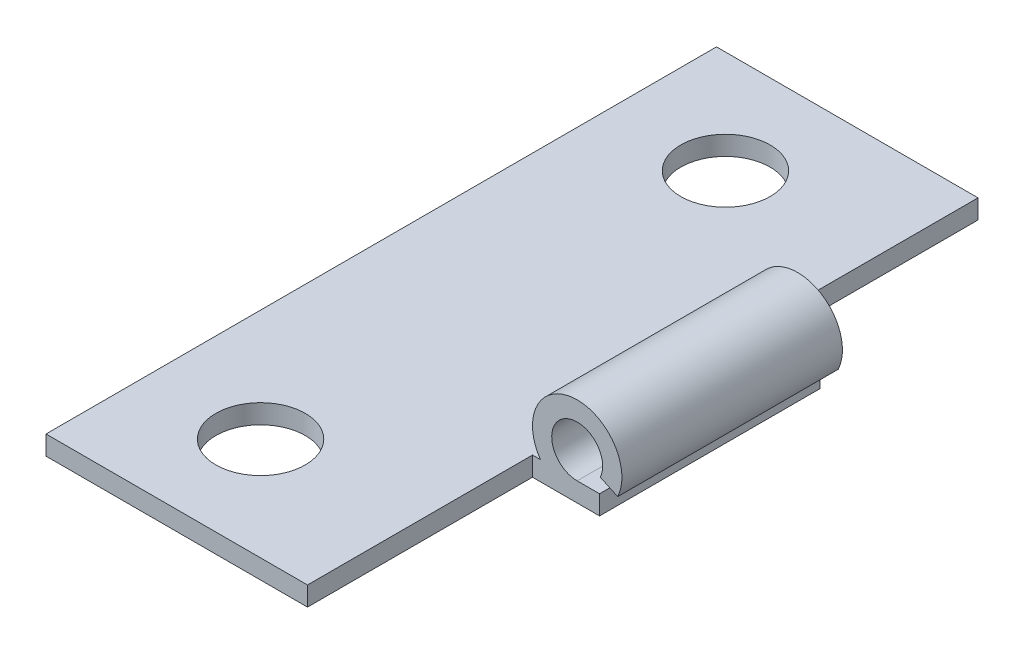
ISO-10303-21;
HEADER;
FILE_DESCRIPTION(('STEP AP214'),'2;1');
FILE_NAME('part.step','',(''),(''),'','','');
FILE_SCHEMA(('AUTOMOTIVE_DESIGN { 1 0 10303 214 1 1 1 1 }'));
ENDSEC;
DATA;
#1=APPLICATION_CONTEXT('core data for automotive mechanical design processes');
#2=APPLICATION_PROTOCOL_DEFINITION('international standard','automotive_design',2000,#1);
#3=PRODUCT_CONTEXT('',#1,'mechanical');
#4=PRODUCT('Part','Part','',(#3));
#5=PRODUCT_RELATED_PRODUCT_CATEGORY('part','',(#4));
#6=PRODUCT_DEFINITION_FORMATION('','',#4);
#7=PRODUCT_DEFINITION_CONTEXT('part definition',#1,'design');
#8=PRODUCT_DEFINITION('design','',#6,#7);
#9=PRODUCT_DEFINITION_SHAPE('','',#8);
#10=(LENGTH_UNIT() NAMED_UNIT(*) SI_UNIT(.MILLI.,.METRE.));
#11=(NAMED_UNIT(*) PLANE_ANGLE_UNIT() SI_UNIT($,.RADIAN.));
#12=(NAMED_UNIT(*) SI_UNIT($,.STERADIAN.) SOLID_ANGLE_UNIT());
#13=UNCERTAINTY_MEASURE_WITH_UNIT(LENGTH_MEASURE(1.E-05),#10,'distance_accuracy_value','');
#14=(GEOMETRIC_REPRESENTATION_CONTEXT(3) GLOBAL_UNCERTAINTY_ASSIGNED_CONTEXT((#13)) GLOBAL_UNIT_ASSIGNED_CONTEXT((#10,
#11,#12)) REPRESENTATION_CONTEXT('',''));
#15=CARTESIAN_POINT('',(0.,0.,0.));
#16=DIRECTION('',(0.,0.,1.));
#17=DIRECTION('',(1.,0.,0.));
#18=AXIS2_PLACEMENT_3D('',#15,#16,#17);
#19=CARTESIAN_POINT('',(0.,1.0922,0.));
#20=DIRECTION('',(0.,1.,0.));
#21=DIRECTION('',(0.,0.,1.));
#22=AXIS2_PLACEMENT_3D('',#19,#20,#21);
#23=PLANE('',#22);
#24=DIRECTION('',(1.,0.,0.));
#25=VECTOR('',#24,1.);
#26=CARTESIAN_POINT('',(0.,1.0922,-25.3153333333333));
#27=LINE('',#26,#25);
#28=CARTESIAN_POINT('',(17.399,1.0922,-25.3153333333333));
#29=VERTEX_POINT('',#28);
#30=CARTESIAN_POINT('',(18.669,1.0922,-25.3153333333333));
#31=VERTEX_POINT('',#30);
#32=EDGE_CURVE('E216',#29,#31,#27,.T.);
#33=ORIENTED_EDGE('',*,*,#32,.F.);
#34=DIRECTION('',(0.,0.,1.));
#35=VECTOR('',#34,1.);
#36=CARTESIAN_POINT('',(17.399,1.0922,-31.7735799096108));
#37=LINE('',#36,#35);
#38=CARTESIAN_POINT('',(17.399,1.0922,-12.7846666666667));
#39=VERTEX_POINT('',#38);
#40=EDGE_CURVE('E214',#29,#39,#37,.T.);
#41=ORIENTED_EDGE('',*,*,#40,.T.);
#42=DIRECTION('',(-1.,0.,0.));
#43=VECTOR('',#42,1.);
#44=CARTESIAN_POINT('',(0.,1.0922,-12.7846666666667));
#45=LINE('',#44,#43);
#46=CARTESIAN_POINT('',(18.669,1.0922,-12.7846666666667));
#47=VERTEX_POINT('',#46);
#48=EDGE_CURVE('E211',#47,#39,#45,.T.);
#49=ORIENTED_EDGE('',*,*,#48,.F.);
#50=DIRECTION('',(0.,0.,1.));
#51=VECTOR('',#50,1.);
#52=CARTESIAN_POINT('',(18.669,1.0922,0.));
#53=LINE('',#52,#51);
#54=EDGE_CURVE('E208',#31,#47,#53,.T.);
#55=ORIENTED_EDGE('',*,*,#54,.F.);
#56=EDGE_LOOP('',(#33,#41,#49,#55));
#57=FACE_BOUND('',#56,.T.);
#58=ADVANCED_FACE('F41',(#57),#23,.T.);
#59=CARTESIAN_POINT('',(0.,1.0922,0.));
#60=DIRECTION('',(0.,0.,-1.));
#61=DIRECTION('',(-1.,0.,0.));
#62=AXIS2_PLACEMENT_3D('',#59,#60,#61);
#63=PLANE('',#62);
#64=DIRECTION('',(1.,0.,0.));
#65=VECTOR('',#64,1.);
#66=CARTESIAN_POINT('',(0.,0.,0.));
#67=LINE('',#66,#65);
#68=CARTESIAN_POINT('',(0.,0.,0.));
#69=VERTEX_POINT('',#68);
#70=CARTESIAN_POINT('',(14.859,0.,0.));
#71=VERTEX_POINT('',#70);
#72=EDGE_CURVE('E161',#69,#71,#67,.T.);
#73=ORIENTED_EDGE('',*,*,#72,.T.);
#74=DIRECTION('',(0.,-1.,0.));
#75=VECTOR('',#74,1.);
#76=CARTESIAN_POINT('',(14.859,1.0922,0.));
#77=LINE('',#76,#75);
#78=CARTESIAN_POINT('',(14.859,1.0922,0.));
#79=VERTEX_POINT('',#78);
#80=EDGE_CURVE('E11',#79,#71,#77,.T.);
#81=ORIENTED_EDGE('',*,*,#80,.F.);
#82=DIRECTION('',(1.,0.,0.));
#83=VECTOR('',#82,1.);
#84=CARTESIAN_POINT('',(0.,1.0922,0.));
#85=LINE('',#84,#83);
#86=CARTESIAN_POINT('',(0.,1.0922,0.));
#87=VERTEX_POINT('',#86);
#88=EDGE_CURVE('E218',#87,#79,#85,.T.);
#89=ORIENTED_EDGE('',*,*,#88,.F.);
#90=DIRECTION('',(0.,-1.,0.));
#91=VECTOR('',#90,1.);
#92=CARTESIAN_POINT('',(0.,1.0922,0.));
#93=LINE('',#92,#91);
#94=EDGE_CURVE('E65',#87,#69,#93,.T.);
#95=ORIENTED_EDGE('',*,*,#94,.T.);
#96=EDGE_LOOP('',(#73,#81,#89,#95));
#97=FACE_BOUND('',#96,.T.);
#98=ADVANCED_FACE('F268',(#97),#63,.F.);
#99=CARTESIAN_POINT('',(14.859,1.0922,0.));
#100=DIRECTION('',(-1.,0.,0.));
#101=DIRECTION('',(0.,0.,1.));
#102=AXIS2_PLACEMENT_3D('',#99,#100,#101);
#103=PLANE('',#102);
#104=DIRECTION('',(0.,0.,-1.));
#105=VECTOR('',#104,1.);
#106=CARTESIAN_POINT('',(14.859,0.,0.));
#107=LINE('',#106,#105);
#108=CARTESIAN_POINT('',(14.859,0.,-12.7846666666667));
#109=VERTEX_POINT('',#108);
#110=EDGE_CURVE('E163',#71,#109,#107,.T.);
#111=ORIENTED_EDGE('',*,*,#110,.T.);
#112=DIRECTION('',(0.,-1.,0.));
#113=VECTOR('',#112,1.);
#114=CARTESIAN_POINT('',(14.859,1.0922,-12.7846666666667));
#115=LINE('',#114,#113);
#116=CARTESIAN_POINT('',(14.859,1.0922,-12.7846666666667));
#117=VERTEX_POINT('',#116);
#118=EDGE_CURVE('E49',#117,#109,#115,.T.);
#119=ORIENTED_EDGE('',*,*,#118,.F.);
#120=DIRECTION('',(0.,0.,-1.));
#121=VECTOR('',#120,1.);
#122=CARTESIAN_POINT('',(14.859,1.0922,0.));
#123=LINE('',#122,#121);
#124=EDGE_CURVE('E104',#79,#117,#123,.T.);
#125=ORIENTED_EDGE('',*,*,#124,.F.);
#126=ORIENTED_EDGE('',*,*,#80,.T.);
#127=EDGE_LOOP('',(#111,#119,#125,#126));
#128=FACE_BOUND('',#127,.T.);
#129=ADVANCED_FACE('F196',(#128),#103,.F.);
#130=CARTESIAN_POINT('',(0.,1.0922,-12.7846666666667));
#131=DIRECTION('',(0.,0.,1.));
#132=DIRECTION('',(1.,0.,0.));
#133=AXIS2_PLACEMENT_3D('',#130,#131,#132);
#134=PLANE('',#133);
#135=DIRECTION('',(-1.,0.,0.));
#136=VECTOR('',#135,1.);
#137=CARTESIAN_POINT('',(0.,0.,-12.7846666666667));
#138=LINE('',#137,#136);
#139=CARTESIAN_POINT('',(18.669,0.,-12.7846666666667));
#140=VERTEX_POINT('',#139);
#141=EDGE_CURVE('E166',#140,#109,#138,.T.);
#142=ORIENTED_EDGE('',*,*,#141,.F.);
#143=DIRECTION('',(0.,-1.,0.));
#144=VECTOR('',#143,1.);
#145=CARTESIAN_POINT('',(18.669,1.0922,-12.7846666666667));
#146=LINE('',#145,#144);
#147=EDGE_CURVE('E189',#47,#140,#146,.T.);
#148=ORIENTED_EDGE('',*,*,#147,.F.);
#149=ORIENTED_EDGE('',*,*,#48,.T.);
#150=CARTESIAN_POINT('',(17.399,2.54,-12.7846666666667));
#151=DIRECTION('',(0.,0.,1.));
#152=DIRECTION('',(1.,0.,0.));
#153=AXIS2_PLACEMENT_3D('',#150,#151,#152);
#154=CIRCLE('',#153,1.4478);
#155=CARTESIAN_POINT('',(18.7111524140717,1.92813328065182,-12.7846666666667));
#156=VERTEX_POINT('',#155);
#157=EDGE_CURVE('E56',#156,#39,#154,.T.);
#158=ORIENTED_EDGE('',*,*,#157,.F.);
#159=DIRECTION('',(0.906307787036649,-0.422618261740701,0.));
#160=VECTOR('',#159,1.);
#161=CARTESIAN_POINT('',(3.6621087619058,8.94561758356565,-12.7846666666667));
#162=LINE('',#161,#160);
#163=CARTESIAN_POINT('',(19.7010217790731,1.46654961517862,-12.7846666666667));
#164=VERTEX_POINT('',#163);
#165=EDGE_CURVE('E238',#156,#164,#162,.T.);
#166=ORIENTED_EDGE('',*,*,#165,.T.);
#167=CARTESIAN_POINT('',(17.399,2.54,-12.7846666666667));
#168=DIRECTION('',(0.,0.,1.));
#169=DIRECTION('',(1.,0.,0.));
#170=AXIS2_PLACEMENT_3D('',#167,#168,#169);
#171=CIRCLE('',#170,2.54);
#172=CARTESIAN_POINT('',(15.3120224821527,1.0922,-12.7846666666667));
#173=VERTEX_POINT('',#172);
#174=EDGE_CURVE('E241',#164,#173,#171,.T.);
#175=ORIENTED_EDGE('',*,*,#174,.T.);
#176=EDGE_CURVE('E195',#173,#117,#45,.T.);
#177=ORIENTED_EDGE('',*,*,#176,.T.);
#178=ORIENTED_EDGE('',*,*,#118,.T.);
#179=EDGE_LOOP('',(#142,#148,#149,#158,#166,#175,#177,#178));
#180=FACE_BOUND('',#179,.T.);
#181=ADVANCED_FACE('F192',(#180),#134,.T.);
#182=CARTESIAN_POINT('',(18.669,1.0922,0.));
#183=DIRECTION('',(1.,0.,0.));
#184=DIRECTION('',(0.,0.,-1.));
#185=AXIS2_PLACEMENT_3D('',#182,#183,#184);
#186=PLANE('',#185);
#187=DIRECTION('',(0.,0.,1.));
#188=VECTOR('',#187,1.);
#189=CARTESIAN_POINT('',(18.669,0.,0.));
#190=LINE('',#189,#188);
#191=CARTESIAN_POINT('',(18.669,0.,-25.3153333333333));
#192=VERTEX_POINT('',#191);
#193=EDGE_CURVE('E169',#192,#140,#190,.T.);
#194=ORIENTED_EDGE('',*,*,#193,.F.);
#195=DIRECTION('',(0.,-1.,0.));
#196=VECTOR('',#195,1.);
#197=CARTESIAN_POINT('',(18.669,1.0922,-25.3153333333333));
#198=LINE('',#197,#196);
#199=EDGE_CURVE('E187',#31,#192,#198,.T.);
#200=ORIENTED_EDGE('',*,*,#199,.F.);
#201=ORIENTED_EDGE('',*,*,#54,.T.);
#202=ORIENTED_EDGE('',*,*,#147,.T.);
#203=EDGE_LOOP('',(#194,#200,#201,#202));
#204=FACE_BOUND('',#203,.T.);
#205=ADVANCED_FACE('F205',(#204),#186,.T.);
#206=CARTESIAN_POINT('',(0.,1.0922,-25.3153333333333));
#207=DIRECTION('',(0.,0.,-1.));
#208=DIRECTION('',(-1.,0.,0.));
#209=AXIS2_PLACEMENT_3D('',#206,#207,#208);
#210=PLANE('',#209);
#211=DIRECTION('',(1.,0.,0.));
#212=VECTOR('',#211,1.);
#213=CARTESIAN_POINT('',(0.,0.,-25.3153333333333));
#214=LINE('',#213,#212);
#215=CARTESIAN_POINT('',(14.859,0.,-25.3153333333333));
#216=VERTEX_POINT('',#215);
#217=EDGE_CURVE('E172',#216,#192,#214,.T.);
#218=ORIENTED_EDGE('',*,*,#217,.F.);
#219=DIRECTION('',(0.,-1.,0.));
#220=VECTOR('',#219,1.);
#221=CARTESIAN_POINT('',(14.859,1.0922,-25.3153333333333));
#222=LINE('',#221,#220);
#223=CARTESIAN_POINT('',(14.859,1.0922,-25.3153333333333));
#224=VERTEX_POINT('',#223);
#225=EDGE_CURVE('E145',#224,#216,#222,.T.);
#226=ORIENTED_EDGE('',*,*,#225,.F.);
#227=CARTESIAN_POINT('',(15.3120224821527,1.0922,-25.3153333333333));
#228=VERTEX_POINT('',#227);
#229=EDGE_CURVE('E134',#224,#228,#27,.T.);
#230=ORIENTED_EDGE('',*,*,#229,.T.);
#231=CARTESIAN_POINT('',(17.399,2.54,-25.3153333333333));
#232=DIRECTION('',(0.,0.,-1.));
#233=DIRECTION('',(-1.,0.,0.));
#234=AXIS2_PLACEMENT_3D('',#231,#232,#233);
#235=CIRCLE('',#234,2.54);
#236=CARTESIAN_POINT('',(19.7010217790731,1.46654961517862,-25.3153333333333));
#237=VERTEX_POINT('',#236);
#238=EDGE_CURVE('E227',#237,#228,#235,.F.);
#239=ORIENTED_EDGE('',*,*,#238,.F.);
#240=DIRECTION('',(0.906307787036649,-0.422618261740701,0.));
#241=VECTOR('',#240,1.);
#242=CARTESIAN_POINT('',(3.6621087619058,8.94561758356565,-25.3153333333333));
#243=LINE('',#242,#241);
#244=CARTESIAN_POINT('',(18.7111524140717,1.92813328065182,-25.3153333333333));
#245=VERTEX_POINT('',#244);
#246=EDGE_CURVE('E228',#245,#237,#243,.T.);
#247=ORIENTED_EDGE('',*,*,#246,.F.);
#248=CARTESIAN_POINT('',(17.399,2.54,-25.3153333333333));
#249=DIRECTION('',(0.,0.,-1.));
#250=DIRECTION('',(-1.,0.,0.));
#251=AXIS2_PLACEMENT_3D('',#248,#249,#250);
#252=CIRCLE('',#251,1.4478);
#253=EDGE_CURVE('E235',#245,#29,#252,.F.);
#254=ORIENTED_EDGE('',*,*,#253,.T.);
#255=ORIENTED_EDGE('',*,*,#32,.T.);
#256=ORIENTED_EDGE('',*,*,#199,.T.);
#257=EDGE_LOOP('',(#218,#226,#230,#239,#247,#254,#255,#256));
#258=FACE_BOUND('',#257,.T.);
#259=ADVANCED_FACE('F266',(#258),#210,.T.);
#260=CARTESIAN_POINT('',(14.859,0.,-38.1));
#261=VERTEX_POINT('',#260);
#262=EDGE_CURVE('E141',#216,#261,#107,.T.);
#263=ORIENTED_EDGE('',*,*,#262,.T.);
#264=DIRECTION('',(0.,-1.,0.));
#265=VECTOR('',#264,1.);
#266=CARTESIAN_POINT('',(14.859,1.0922,-38.1));
#267=LINE('',#266,#265);
#268=CARTESIAN_POINT('',(14.859,1.0922,-38.1));
#269=VERTEX_POINT('',#268);
#270=EDGE_CURVE('E138',#269,#261,#267,.T.);
#271=ORIENTED_EDGE('',*,*,#270,.F.);
#272=EDGE_CURVE('E125',#224,#269,#123,.T.);
#273=ORIENTED_EDGE('',*,*,#272,.F.);
#274=ORIENTED_EDGE('',*,*,#225,.T.);
#275=EDGE_LOOP('',(#263,#271,#273,#274));
#276=FACE_BOUND('',#275,.T.);
#277=ADVANCED_FACE('F139',(#276),#103,.F.);
#278=CARTESIAN_POINT('',(0.,1.0922,-38.1));
#279=DIRECTION('',(0.,0.,-1.));
#280=DIRECTION('',(-1.,0.,0.));
#281=AXIS2_PLACEMENT_3D('',#278,#279,#280);
#282=PLANE('',#281);
#283=DIRECTION('',(1.,0.,0.));
#284=VECTOR('',#283,1.);
#285=CARTESIAN_POINT('',(0.,0.,-38.1));
#286=LINE('',#285,#284);
#287=CARTESIAN_POINT('',(0.,0.,-38.1));
#288=VERTEX_POINT('',#287);
#289=EDGE_CURVE('E175',#288,#261,#286,.T.);
#290=ORIENTED_EDGE('',*,*,#289,.F.);
#291=DIRECTION('',(0.,-1.,0.));
#292=VECTOR('',#291,1.);
#293=CARTESIAN_POINT('',(0.,1.0922,-38.1));
#294=LINE('',#293,#292);
#295=CARTESIAN_POINT('',(0.,1.0922,-38.1));
#296=VERTEX_POINT('',#295);
#297=EDGE_CURVE('E146',#296,#288,#294,.T.);
#298=ORIENTED_EDGE('',*,*,#297,.F.);
#299=DIRECTION('',(1.,0.,0.));
#300=VECTOR('',#299,1.);
#301=CARTESIAN_POINT('',(0.,1.0922,-38.1));
#302=LINE('',#301,#300);
#303=EDGE_CURVE('E132',#296,#269,#302,.T.);
#304=ORIENTED_EDGE('',*,*,#303,.T.);
#305=ORIENTED_EDGE('',*,*,#270,.T.);
#306=EDGE_LOOP('',(#290,#298,#304,#305));
#307=FACE_BOUND('',#306,.T.);
#308=ADVANCED_FACE('F148',(#307),#282,.T.);
#309=CARTESIAN_POINT('',(0.,1.0922,0.));
#310=DIRECTION('',(-1.,0.,0.));
#311=DIRECTION('',(0.,0.,1.));
#312=AXIS2_PLACEMENT_3D('',#309,#310,#311);
#313=PLANE('',#312);
#314=DIRECTION('',(0.,0.,-1.));
#315=VECTOR('',#314,1.);
#316=CARTESIAN_POINT('',(0.,0.,0.));
#317=LINE('',#316,#315);
#318=EDGE_CURVE('E177',#69,#288,#317,.T.);
#319=ORIENTED_EDGE('',*,*,#318,.F.);
#320=ORIENTED_EDGE('',*,*,#94,.F.);
#321=DIRECTION('',(0.,0.,-1.));
#322=VECTOR('',#321,1.);
#323=CARTESIAN_POINT('',(0.,1.0922,0.));
#324=LINE('',#323,#322);
#325=EDGE_CURVE('E149',#87,#296,#324,.T.);
#326=ORIENTED_EDGE('',*,*,#325,.T.);
#327=ORIENTED_EDGE('',*,*,#297,.T.);
#328=EDGE_LOOP('',(#319,#320,#326,#327));
#329=FACE_BOUND('',#328,.T.);
#330=ADVANCED_FACE('F269',(#329),#313,.T.);
#331=CARTESIAN_POINT('',(6.35,1.0922,-5.842));
#332=DIRECTION('',(0.,-1.,0.));
#333=DIRECTION('',(0.,0.,-1.));
#334=AXIS2_PLACEMENT_3D('',#331,#332,#333);
#335=CYLINDRICAL_SURFACE('',#334,2.54);
#336=CARTESIAN_POINT('',(6.35,1.0922,-5.842));
#337=DIRECTION('',(0.,1.,0.));
#338=DIRECTION('',(0.,0.,1.));
#339=AXIS2_PLACEMENT_3D('',#336,#337,#338);
#340=CIRCLE('',#339,2.54);
#341=CARTESIAN_POINT('',(6.35,1.0922,-3.302));
#342=VERTEX_POINT('',#341);
#343=EDGE_CURVE('E183',#342,#342,#340,.F.);
#344=ORIENTED_EDGE('',*,*,#343,.F.);
#345=EDGE_LOOP('',(#344));
#346=FACE_BOUND('',#345,.T.);
#347=CARTESIAN_POINT('',(6.35,0.,-5.842));
#348=DIRECTION('',(0.,1.,0.));
#349=DIRECTION('',(0.,0.,1.));
#350=AXIS2_PLACEMENT_3D('',#347,#348,#349);
#351=CIRCLE('',#350,2.54);
#352=CARTESIAN_POINT('',(6.35,0.,-3.302));
#353=VERTEX_POINT('',#352);
#354=EDGE_CURVE('E158',#353,#353,#351,.F.);
#355=ORIENTED_EDGE('',*,*,#354,.T.);
#356=EDGE_LOOP('',(#355));
#357=FACE_BOUND('',#356,.T.);
#358=ADVANCED_FACE('F43',(#346,#357),#335,.F.);
#359=CARTESIAN_POINT('',(6.35,1.0922,-32.258));
#360=DIRECTION('',(0.,-1.,0.));
#361=DIRECTION('',(0.,0.,-1.));
#362=AXIS2_PLACEMENT_3D('',#359,#360,#361);
#363=CYLINDRICAL_SURFACE('',#362,2.54);
#364=CARTESIAN_POINT('',(6.35,1.0922,-32.258));
#365=DIRECTION('',(0.,1.,0.));
#366=DIRECTION('',(0.,0.,1.));
#367=AXIS2_PLACEMENT_3D('',#364,#365,#366);
#368=CIRCLE('',#367,2.54);
#369=CARTESIAN_POINT('',(6.35,1.0922,-29.718));
#370=VERTEX_POINT('',#369);
#371=EDGE_CURVE('E151',#370,#370,#368,.F.);
#372=ORIENTED_EDGE('',*,*,#371,.F.);
#373=EDGE_LOOP('',(#372));
#374=FACE_BOUND('',#373,.T.);
#375=CARTESIAN_POINT('',(6.35,0.,-32.258));
#376=DIRECTION('',(0.,1.,0.));
#377=DIRECTION('',(0.,0.,1.));
#378=AXIS2_PLACEMENT_3D('',#375,#376,#377);
#379=CIRCLE('',#378,2.54);
#380=CARTESIAN_POINT('',(6.35,0.,-29.718));
#381=VERTEX_POINT('',#380);
#382=EDGE_CURVE('E180',#381,#381,#379,.F.);
#383=ORIENTED_EDGE('',*,*,#382,.T.);
#384=EDGE_LOOP('',(#383));
#385=FACE_BOUND('',#384,.T.);
#386=ADVANCED_FACE('F285',(#374,#385),#363,.F.);
#387=DIRECTION('',(0.,0.,1.));
#388=VECTOR('',#387,1.);
#389=CARTESIAN_POINT('',(15.3120224821527,1.0922,-31.7735799096108));
#390=LINE('',#389,#388);
#391=EDGE_CURVE('E229',#228,#173,#390,.T.);
#392=ORIENTED_EDGE('',*,*,#391,.F.);
#393=ORIENTED_EDGE('',*,*,#229,.F.);
#394=ORIENTED_EDGE('',*,*,#272,.T.);
#395=ORIENTED_EDGE('',*,*,#303,.F.);
#396=ORIENTED_EDGE('',*,*,#325,.F.);
#397=ORIENTED_EDGE('',*,*,#88,.T.);
#398=ORIENTED_EDGE('',*,*,#124,.T.);
#399=ORIENTED_EDGE('',*,*,#176,.F.);
#400=EDGE_LOOP('',(#392,#393,#394,#395,#396,#397,#398,#399));
#401=FACE_BOUND('',#400,.T.);
#402=ORIENTED_EDGE('',*,*,#343,.T.);
#403=EDGE_LOOP('',(#402));
#404=FACE_BOUND('',#403,.T.);
#405=ORIENTED_EDGE('',*,*,#371,.T.);
#406=EDGE_LOOP('',(#405));
#407=FACE_BOUND('',#406,.T.);
#408=ADVANCED_FACE('F128',(#401,#404,#407),#23,.T.);
#409=CARTESIAN_POINT('',(0.,0.,0.));
#410=DIRECTION('',(0.,1.,0.));
#411=DIRECTION('',(0.,0.,1.));
#412=AXIS2_PLACEMENT_3D('',#409,#410,#411);
#413=PLANE('',#412);
#414=ORIENTED_EDGE('',*,*,#354,.F.);
#415=EDGE_LOOP('',(#414));
#416=FACE_BOUND('',#415,.T.);
#417=ORIENTED_EDGE('',*,*,#72,.F.);
#418=ORIENTED_EDGE('',*,*,#318,.T.);
#419=ORIENTED_EDGE('',*,*,#289,.T.);
#420=ORIENTED_EDGE('',*,*,#262,.F.);
#421=ORIENTED_EDGE('',*,*,#217,.T.);
#422=ORIENTED_EDGE('',*,*,#193,.T.);
#423=ORIENTED_EDGE('',*,*,#141,.T.);
#424=ORIENTED_EDGE('',*,*,#110,.F.);
#425=EDGE_LOOP('',(#417,#418,#419,#420,#421,#422,#423,#424));
#426=FACE_BOUND('',#425,.T.);
#427=ORIENTED_EDGE('',*,*,#382,.F.);
#428=EDGE_LOOP('',(#427));
#429=FACE_BOUND('',#428,.T.);
#430=ADVANCED_FACE('F199',(#416,#426,#429),#413,.F.);
#431=CARTESIAN_POINT('',(3.6621087619058,8.94561758356565,-31.7735799096108));
#432=DIRECTION('',(-0.422618261740701,-0.906307787036649,0.));
#433=DIRECTION('',(0.906307787036649,-0.422618261740701,0.));
#434=AXIS2_PLACEMENT_3D('',#431,#432,#433);
#435=PLANE('',#434);
#436=DIRECTION('',(0.,0.,1.));
#437=VECTOR('',#436,1.);
#438=CARTESIAN_POINT('',(18.7111524140717,1.92813328065182,-31.7735799096108));
#439=LINE('',#438,#437);
#440=EDGE_CURVE('E222',#245,#156,#439,.T.);
#441=ORIENTED_EDGE('',*,*,#440,.F.);
#442=ORIENTED_EDGE('',*,*,#246,.T.);
#443=DIRECTION('',(0.,0.,1.));
#444=VECTOR('',#443,1.);
#445=CARTESIAN_POINT('',(19.7010217790731,1.46654961517862,-31.7735799096108));
#446=LINE('',#445,#444);
#447=EDGE_CURVE('E224',#237,#164,#446,.T.);
#448=ORIENTED_EDGE('',*,*,#447,.T.);
#449=ORIENTED_EDGE('',*,*,#165,.F.);
#450=EDGE_LOOP('',(#441,#442,#448,#449));
#451=FACE_BOUND('',#450,.T.);
#452=ADVANCED_FACE('F253',(#451),#435,.T.);
#453=CARTESIAN_POINT('',(17.399,2.54,-31.7735799096108));
#454=DIRECTION('',(0.,0.,1.));
#455=DIRECTION('',(1.,0.,0.));
#456=AXIS2_PLACEMENT_3D('',#453,#454,#455);
#457=CYLINDRICAL_SURFACE('',#456,2.54);
#458=ORIENTED_EDGE('',*,*,#447,.F.);
#459=ORIENTED_EDGE('',*,*,#238,.T.);
#460=ORIENTED_EDGE('',*,*,#391,.T.);
#461=ORIENTED_EDGE('',*,*,#174,.F.);
#462=EDGE_LOOP('',(#458,#459,#460,#461));
#463=FACE_BOUND('',#462,.T.);
#464=ADVANCED_FACE('F267',(#463),#457,.T.);
#465=CARTESIAN_POINT('',(17.399,2.54,-31.7735799096108));
#466=DIRECTION('',(0.,0.,1.));
#467=DIRECTION('',(1.,0.,0.));
#468=AXIS2_PLACEMENT_3D('',#465,#466,#467);
#469=CYLINDRICAL_SURFACE('',#468,1.4478);
#470=ORIENTED_EDGE('',*,*,#253,.F.);
#471=ORIENTED_EDGE('',*,*,#440,.T.);
#472=ORIENTED_EDGE('',*,*,#157,.T.);
#473=ORIENTED_EDGE('',*,*,#40,.F.);
#474=EDGE_LOOP('',(#470,#471,#472,#473));
#475=FACE_BOUND('',#474,.T.);
#476=ADVANCED_FACE('F270',(#475),#469,.F.);
#477=CLOSED_SHELL('',(#58,#98,#129,#181,#205,#259,#277,#308,#330,#358,#386,#408,#430,#452,#464,#476));
#478=MANIFOLD_SOLID_BREP('B2',#477);
#479=ADVANCED_BREP_SHAPE_REPRESENTATION('',(#18,#478),#14);
#480=SHAPE_DEFINITION_REPRESENTATION(#9,#479);
ENDSEC;
END-ISO-10303-21;
